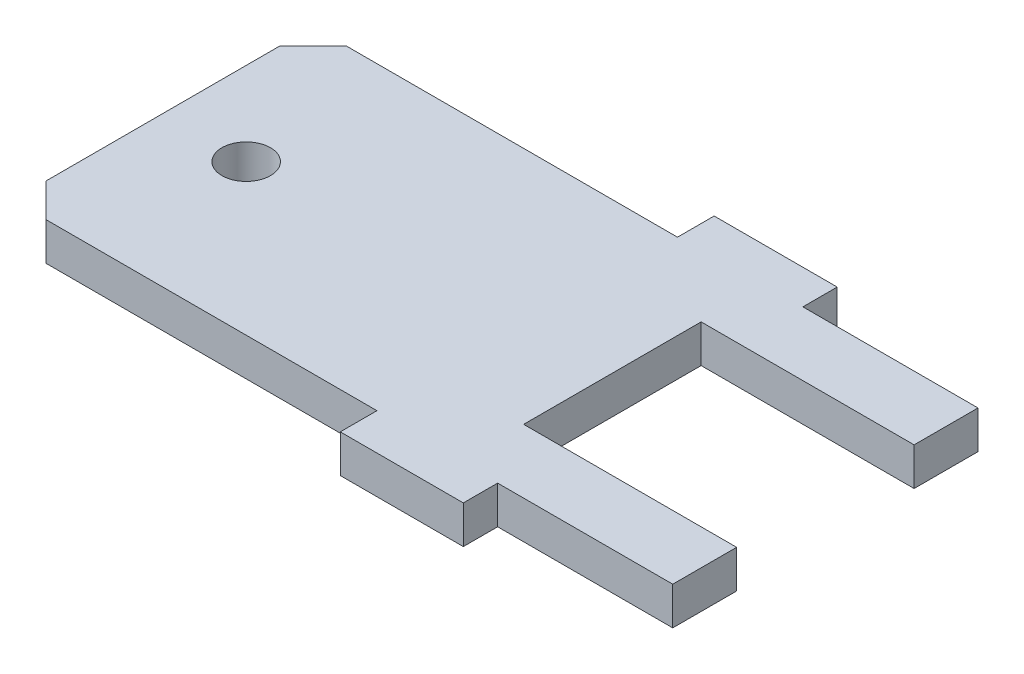
ISO-10303-21;
HEADER;
FILE_DESCRIPTION(('STEP AP214'),'2;1');
FILE_NAME('part.step','',(''),(''),'','','');
FILE_SCHEMA(('AUTOMOTIVE_DESIGN { 1 0 10303 214 1 1 1 1 }'));
ENDSEC;
DATA;
#1=APPLICATION_CONTEXT('core data for automotive mechanical design processes');
#2=APPLICATION_PROTOCOL_DEFINITION('international standard','automotive_design',2000,#1);
#3=PRODUCT_CONTEXT('',#1,'mechanical');
#4=PRODUCT('Part','Part','',(#3));
#5=PRODUCT_RELATED_PRODUCT_CATEGORY('part','',(#4));
#6=PRODUCT_DEFINITION_FORMATION('','',#4);
#7=PRODUCT_DEFINITION_CONTEXT('part definition',#1,'design');
#8=PRODUCT_DEFINITION('design','',#6,#7);
#9=PRODUCT_DEFINITION_SHAPE('','',#8);
#10=(LENGTH_UNIT() NAMED_UNIT(*) SI_UNIT(.MILLI.,.METRE.));
#11=(NAMED_UNIT(*) PLANE_ANGLE_UNIT() SI_UNIT($,.RADIAN.));
#12=(NAMED_UNIT(*) SI_UNIT($,.STERADIAN.) SOLID_ANGLE_UNIT());
#13=UNCERTAINTY_MEASURE_WITH_UNIT(LENGTH_MEASURE(1.E-05),#10,'distance_accuracy_value','');
#14=(GEOMETRIC_REPRESENTATION_CONTEXT(3) GLOBAL_UNCERTAINTY_ASSIGNED_CONTEXT((#13)) GLOBAL_UNIT_ASSIGNED_CONTEXT((#10,
#11,#12)) REPRESENTATION_CONTEXT('',''));
#15=CARTESIAN_POINT('',(0.,0.,0.));
#16=DIRECTION('',(0.,0.,1.));
#17=DIRECTION('',(1.,0.,0.));
#18=AXIS2_PLACEMENT_3D('',#15,#16,#17);
#19=CARTESIAN_POINT('',(0.,0.4,0.));
#20=DIRECTION('',(0.,-1.,0.));
#21=DIRECTION('',(0.,0.,-1.));
#22=AXIS2_PLACEMENT_3D('',#19,#20,#21);
#23=PLANE('',#22);
#24=DIRECTION('',(-0.707106781186547,0.,0.707106781186548));
#25=VECTOR('',#24,1.);
#26=CARTESIAN_POINT('',(0.,0.4,-2.46789321881345));
#27=LINE('',#26,#25);
#28=CARTESIAN_POINT('',(0.707106781186547,0.4,-3.175));
#29=VERTEX_POINT('',#28);
#30=CARTESIAN_POINT('',(0.,0.4,-2.46789321881345));
#31=VERTEX_POINT('',#30);
#32=EDGE_CURVE('E227',#29,#31,#27,.T.);
#33=ORIENTED_EDGE('',*,*,#32,.T.);
#34=DIRECTION('',(0.,0.,1.));
#35=VECTOR('',#34,1.);
#36=CARTESIAN_POINT('',(0.,0.4,2.46789321881345));
#37=LINE('',#36,#35);
#38=CARTESIAN_POINT('',(0.,0.4,2.46789321881345));
#39=VERTEX_POINT('',#38);
#40=EDGE_CURVE('E125',#31,#39,#37,.T.);
#41=ORIENTED_EDGE('',*,*,#40,.T.);
#42=DIRECTION('',(0.707106781186547,0.,0.707106781186548));
#43=VECTOR('',#42,1.);
#44=CARTESIAN_POINT('',(0.,0.4,2.46789321881345));
#45=LINE('',#44,#43);
#46=CARTESIAN_POINT('',(0.707106781186547,0.4,3.175));
#47=VERTEX_POINT('',#46);
#48=EDGE_CURVE('E272',#39,#47,#45,.T.);
#49=ORIENTED_EDGE('',*,*,#48,.T.);
#50=DIRECTION('',(1.,0.,0.));
#51=VECTOR('',#50,1.);
#52=CARTESIAN_POINT('',(0.707106781186547,0.4,3.175));
#53=LINE('',#52,#51);
#54=CARTESIAN_POINT('',(7.7,0.4,3.175));
#55=VERTEX_POINT('',#54);
#56=EDGE_CURVE('E291',#47,#55,#53,.T.);
#57=ORIENTED_EDGE('',*,*,#56,.T.);
#58=DIRECTION('',(0.,0.,1.));
#59=VECTOR('',#58,1.);
#60=CARTESIAN_POINT('',(7.7,0.4,3.175));
#61=LINE('',#60,#59);
#62=CARTESIAN_POINT('',(7.7,0.4,3.95));
#63=VERTEX_POINT('',#62);
#64=EDGE_CURVE('E288',#55,#63,#61,.T.);
#65=ORIENTED_EDGE('',*,*,#64,.T.);
#66=DIRECTION('',(1.,0.,0.));
#67=VECTOR('',#66,1.);
#68=CARTESIAN_POINT('',(7.7,0.4,3.95));
#69=LINE('',#68,#67);
#70=CARTESIAN_POINT('',(10.3,0.4,3.95));
#71=VERTEX_POINT('',#70);
#72=EDGE_CURVE('E290',#63,#71,#69,.T.);
#73=ORIENTED_EDGE('',*,*,#72,.T.);
#74=DIRECTION('',(0.,0.,-1.));
#75=VECTOR('',#74,1.);
#76=CARTESIAN_POINT('',(10.3,0.4,3.95));
#77=LINE('',#76,#75);
#78=CARTESIAN_POINT('',(10.3,0.4,3.225));
#79=VERTEX_POINT('',#78);
#80=EDGE_CURVE('E293',#71,#79,#77,.T.);
#81=ORIENTED_EDGE('',*,*,#80,.T.);
#82=DIRECTION('',(1.,0.,0.));
#83=VECTOR('',#82,1.);
#84=CARTESIAN_POINT('',(10.3,0.4,3.225));
#85=LINE('',#84,#83);
#86=CARTESIAN_POINT('',(14.,0.4,3.225));
#87=VERTEX_POINT('',#86);
#88=EDGE_CURVE('E299',#79,#87,#85,.T.);
#89=ORIENTED_EDGE('',*,*,#88,.T.);
#90=DIRECTION('',(0.,0.,-1.));
#91=VECTOR('',#90,1.);
#92=CARTESIAN_POINT('',(14.,0.4,3.225));
#93=LINE('',#92,#91);
#94=CARTESIAN_POINT('',(14.,0.4,1.875));
#95=VERTEX_POINT('',#94);
#96=EDGE_CURVE('E301',#87,#95,#93,.T.);
#97=ORIENTED_EDGE('',*,*,#96,.T.);
#98=DIRECTION('',(-1.,0.,0.));
#99=VECTOR('',#98,1.);
#100=CARTESIAN_POINT('',(14.,0.4,1.875));
#101=LINE('',#100,#99);
#102=CARTESIAN_POINT('',(9.5,0.4,1.875));
#103=VERTEX_POINT('',#102);
#104=EDGE_CURVE('E303',#95,#103,#101,.T.);
#105=ORIENTED_EDGE('',*,*,#104,.T.);
#106=DIRECTION('',(0.,0.,-1.));
#107=VECTOR('',#106,1.);
#108=CARTESIAN_POINT('',(9.5,0.4,-1.875));
#109=LINE('',#108,#107);
#110=CARTESIAN_POINT('',(9.5,0.4,-1.875));
#111=VERTEX_POINT('',#110);
#112=EDGE_CURVE('E305',#103,#111,#109,.T.);
#113=ORIENTED_EDGE('',*,*,#112,.T.);
#114=DIRECTION('',(1.,0.,0.));
#115=VECTOR('',#114,1.);
#116=CARTESIAN_POINT('',(14.,0.4,-1.875));
#117=LINE('',#116,#115);
#118=CARTESIAN_POINT('',(14.,0.4,-1.875));
#119=VERTEX_POINT('',#118);
#120=EDGE_CURVE('E307',#111,#119,#117,.T.);
#121=ORIENTED_EDGE('',*,*,#120,.T.);
#122=DIRECTION('',(0.,0.,-1.));
#123=VECTOR('',#122,1.);
#124=CARTESIAN_POINT('',(14.,0.4,-3.225));
#125=LINE('',#124,#123);
#126=CARTESIAN_POINT('',(14.,0.4,-3.225));
#127=VERTEX_POINT('',#126);
#128=EDGE_CURVE('E309',#119,#127,#125,.T.);
#129=ORIENTED_EDGE('',*,*,#128,.T.);
#130=DIRECTION('',(-1.,0.,0.));
#131=VECTOR('',#130,1.);
#132=CARTESIAN_POINT('',(10.3,0.4,-3.225));
#133=LINE('',#132,#131);
#134=CARTESIAN_POINT('',(10.3,0.4,-3.225));
#135=VERTEX_POINT('',#134);
#136=EDGE_CURVE('E311',#127,#135,#133,.T.);
#137=ORIENTED_EDGE('',*,*,#136,.T.);
#138=DIRECTION('',(0.,0.,-1.));
#139=VECTOR('',#138,1.);
#140=CARTESIAN_POINT('',(10.3,0.4,-3.95));
#141=LINE('',#140,#139);
#142=CARTESIAN_POINT('',(10.3,0.4,-3.95));
#143=VERTEX_POINT('',#142);
#144=EDGE_CURVE('E174',#135,#143,#141,.T.);
#145=ORIENTED_EDGE('',*,*,#144,.T.);
#146=DIRECTION('',(-1.,0.,0.));
#147=VECTOR('',#146,1.);
#148=CARTESIAN_POINT('',(7.7,0.4,-3.95));
#149=LINE('',#148,#147);
#150=CARTESIAN_POINT('',(7.7,0.4,-3.95));
#151=VERTEX_POINT('',#150);
#152=EDGE_CURVE('E168',#143,#151,#149,.T.);
#153=ORIENTED_EDGE('',*,*,#152,.T.);
#154=DIRECTION('',(0.,0.,1.));
#155=VECTOR('',#154,1.);
#156=CARTESIAN_POINT('',(7.7,0.4,-3.175));
#157=LINE('',#156,#155);
#158=CARTESIAN_POINT('',(7.7,0.4,-3.175));
#159=VERTEX_POINT('',#158);
#160=EDGE_CURVE('E172',#151,#159,#157,.T.);
#161=ORIENTED_EDGE('',*,*,#160,.T.);
#162=DIRECTION('',(-1.,0.,0.));
#163=VECTOR('',#162,1.);
#164=CARTESIAN_POINT('',(0.707106781186547,0.4,-3.175));
#165=LINE('',#164,#163);
#166=EDGE_CURVE('E52',#159,#29,#165,.T.);
#167=ORIENTED_EDGE('',*,*,#166,.T.);
#168=EDGE_LOOP('',(#33,#41,#49,#57,#65,#73,#81,#89,#97,#105,#113,#121,#129,#137,#145,#153,#161,#167));
#169=FACE_BOUND('',#168,.T.);
#170=CARTESIAN_POINT('',(1.76190311126471,0.4,0.));
#171=DIRECTION('',(0.,1.,0.));
#172=DIRECTION('',(0.,0.,1.));
#173=AXIS2_PLACEMENT_3D('',#170,#171,#172);
#174=CIRCLE('',#173,0.512380355604943);
#175=CARTESIAN_POINT('',(1.76190311126471,0.4,0.512380355604943));
#176=VERTEX_POINT('',#175);
#177=EDGE_CURVE('E196',#176,#176,#174,.T.);
#178=ORIENTED_EDGE('',*,*,#177,.F.);
#179=EDGE_LOOP('',(#178));
#180=FACE_BOUND('',#179,.T.);
#181=ADVANCED_FACE('F35',(#169,#180),#23,.F.);
#182=CARTESIAN_POINT('',(0.,-0.4,0.));
#183=DIRECTION('',(0.,-1.,0.));
#184=DIRECTION('',(0.,0.,-1.));
#185=AXIS2_PLACEMENT_3D('',#182,#183,#184);
#186=PLANE('',#185);
#187=DIRECTION('',(-0.707106781186547,0.,0.707106781186548));
#188=VECTOR('',#187,1.);
#189=CARTESIAN_POINT('',(0.,-0.4,-2.46789321881345));
#190=LINE('',#189,#188);
#191=CARTESIAN_POINT('',(0.707106781186547,-0.4,-3.175));
#192=VERTEX_POINT('',#191);
#193=CARTESIAN_POINT('',(0.,-0.4,-2.46789321881345));
#194=VERTEX_POINT('',#193);
#195=EDGE_CURVE('E192',#192,#194,#190,.T.);
#196=ORIENTED_EDGE('',*,*,#195,.F.);
#197=DIRECTION('',(-1.,0.,0.));
#198=VECTOR('',#197,1.);
#199=CARTESIAN_POINT('',(0.707106781186547,-0.4,-3.175));
#200=LINE('',#199,#198);
#201=CARTESIAN_POINT('',(7.7,-0.4,-3.175));
#202=VERTEX_POINT('',#201);
#203=EDGE_CURVE('E117',#202,#192,#200,.T.);
#204=ORIENTED_EDGE('',*,*,#203,.F.);
#205=DIRECTION('',(0.,0.,1.));
#206=VECTOR('',#205,1.);
#207=CARTESIAN_POINT('',(7.7,-0.4,-3.175));
#208=LINE('',#207,#206);
#209=CARTESIAN_POINT('',(7.7,-0.4,-3.95));
#210=VERTEX_POINT('',#209);
#211=EDGE_CURVE('E111',#210,#202,#208,.T.);
#212=ORIENTED_EDGE('',*,*,#211,.F.);
#213=DIRECTION('',(-1.,0.,0.));
#214=VECTOR('',#213,1.);
#215=CARTESIAN_POINT('',(7.7,-0.4,-3.95));
#216=LINE('',#215,#214);
#217=CARTESIAN_POINT('',(10.3,-0.4,-3.95));
#218=VERTEX_POINT('',#217);
#219=EDGE_CURVE('E182',#218,#210,#216,.T.);
#220=ORIENTED_EDGE('',*,*,#219,.F.);
#221=DIRECTION('',(0.,0.,-1.));
#222=VECTOR('',#221,1.);
#223=CARTESIAN_POINT('',(10.3,-0.4,-3.95));
#224=LINE('',#223,#222);
#225=CARTESIAN_POINT('',(10.3,-0.4,-3.225));
#226=VERTEX_POINT('',#225);
#227=EDGE_CURVE('E222',#226,#218,#224,.T.);
#228=ORIENTED_EDGE('',*,*,#227,.F.);
#229=DIRECTION('',(-1.,0.,0.));
#230=VECTOR('',#229,1.);
#231=CARTESIAN_POINT('',(10.3,-0.4,-3.225));
#232=LINE('',#231,#230);
#233=CARTESIAN_POINT('',(14.,-0.4,-3.225));
#234=VERTEX_POINT('',#233);
#235=EDGE_CURVE('E220',#234,#226,#232,.T.);
#236=ORIENTED_EDGE('',*,*,#235,.F.);
#237=DIRECTION('',(0.,0.,-1.));
#238=VECTOR('',#237,1.);
#239=CARTESIAN_POINT('',(14.,-0.4,-3.225));
#240=LINE('',#239,#238);
#241=CARTESIAN_POINT('',(14.,-0.4,-1.875));
#242=VERTEX_POINT('',#241);
#243=EDGE_CURVE('E218',#242,#234,#240,.T.);
#244=ORIENTED_EDGE('',*,*,#243,.F.);
#245=DIRECTION('',(1.,0.,0.));
#246=VECTOR('',#245,1.);
#247=CARTESIAN_POINT('',(14.,-0.4,-1.875));
#248=LINE('',#247,#246);
#249=CARTESIAN_POINT('',(9.5,-0.4,-1.875));
#250=VERTEX_POINT('',#249);
#251=EDGE_CURVE('E216',#250,#242,#248,.T.);
#252=ORIENTED_EDGE('',*,*,#251,.F.);
#253=DIRECTION('',(0.,0.,-1.));
#254=VECTOR('',#253,1.);
#255=CARTESIAN_POINT('',(9.5,-0.4,-1.875));
#256=LINE('',#255,#254);
#257=CARTESIAN_POINT('',(9.5,-0.4,1.875));
#258=VERTEX_POINT('',#257);
#259=EDGE_CURVE('E214',#258,#250,#256,.T.);
#260=ORIENTED_EDGE('',*,*,#259,.F.);
#261=DIRECTION('',(-1.,0.,0.));
#262=VECTOR('',#261,1.);
#263=CARTESIAN_POINT('',(14.,-0.4,1.875));
#264=LINE('',#263,#262);
#265=CARTESIAN_POINT('',(14.,-0.4,1.875));
#266=VERTEX_POINT('',#265);
#267=EDGE_CURVE('E212',#266,#258,#264,.T.);
#268=ORIENTED_EDGE('',*,*,#267,.F.);
#269=DIRECTION('',(0.,0.,-1.));
#270=VECTOR('',#269,1.);
#271=CARTESIAN_POINT('',(14.,-0.4,3.225));
#272=LINE('',#271,#270);
#273=CARTESIAN_POINT('',(14.,-0.4,3.225));
#274=VERTEX_POINT('',#273);
#275=EDGE_CURVE('E210',#274,#266,#272,.T.);
#276=ORIENTED_EDGE('',*,*,#275,.F.);
#277=DIRECTION('',(1.,0.,0.));
#278=VECTOR('',#277,1.);
#279=CARTESIAN_POINT('',(10.3,-0.4,3.225));
#280=LINE('',#279,#278);
#281=CARTESIAN_POINT('',(10.3,-0.4,3.225));
#282=VERTEX_POINT('',#281);
#283=EDGE_CURVE('E208',#282,#274,#280,.T.);
#284=ORIENTED_EDGE('',*,*,#283,.F.);
#285=DIRECTION('',(0.,0.,-1.));
#286=VECTOR('',#285,1.);
#287=CARTESIAN_POINT('',(10.3,-0.4,3.95));
#288=LINE('',#287,#286);
#289=CARTESIAN_POINT('',(10.3,-0.4,3.95));
#290=VERTEX_POINT('',#289);
#291=EDGE_CURVE('E206',#290,#282,#288,.T.);
#292=ORIENTED_EDGE('',*,*,#291,.F.);
#293=DIRECTION('',(1.,0.,0.));
#294=VECTOR('',#293,1.);
#295=CARTESIAN_POINT('',(7.7,-0.4,3.95));
#296=LINE('',#295,#294);
#297=CARTESIAN_POINT('',(7.7,-0.4,3.95));
#298=VERTEX_POINT('',#297);
#299=EDGE_CURVE('E204',#298,#290,#296,.T.);
#300=ORIENTED_EDGE('',*,*,#299,.F.);
#301=DIRECTION('',(0.,0.,1.));
#302=VECTOR('',#301,1.);
#303=CARTESIAN_POINT('',(7.7,-0.4,3.175));
#304=LINE('',#303,#302);
#305=CARTESIAN_POINT('',(7.7,-0.4,3.175));
#306=VERTEX_POINT('',#305);
#307=EDGE_CURVE('E202',#306,#298,#304,.T.);
#308=ORIENTED_EDGE('',*,*,#307,.F.);
#309=DIRECTION('',(1.,0.,0.));
#310=VECTOR('',#309,1.);
#311=CARTESIAN_POINT('',(0.707106781186547,-0.4,3.175));
#312=LINE('',#311,#310);
#313=CARTESIAN_POINT('',(0.707106781186547,-0.4,3.175));
#314=VERTEX_POINT('',#313);
#315=EDGE_CURVE('E200',#314,#306,#312,.T.);
#316=ORIENTED_EDGE('',*,*,#315,.F.);
#317=DIRECTION('',(0.707106781186547,0.,0.707106781186548));
#318=VECTOR('',#317,1.);
#319=CARTESIAN_POINT('',(0.,-0.4,2.46789321881345));
#320=LINE('',#319,#318);
#321=CARTESIAN_POINT('',(0.,-0.4,2.46789321881345));
#322=VERTEX_POINT('',#321);
#323=EDGE_CURVE('E198',#322,#314,#320,.T.);
#324=ORIENTED_EDGE('',*,*,#323,.F.);
#325=DIRECTION('',(0.,0.,1.));
#326=VECTOR('',#325,1.);
#327=CARTESIAN_POINT('',(0.,-0.4,2.46789321881345));
#328=LINE('',#327,#326);
#329=EDGE_CURVE('E195',#194,#322,#328,.T.);
#330=ORIENTED_EDGE('',*,*,#329,.F.);
#331=EDGE_LOOP('',(#196,#204,#212,#220,#228,#236,#244,#252,#260,#268,#276,#284,#292,#300,#308,
#316,#324,#330));
#332=FACE_BOUND('',#331,.T.);
#333=CARTESIAN_POINT('',(1.76190311126471,-0.4,0.));
#334=DIRECTION('',(0.,1.,0.));
#335=DIRECTION('',(0.,0.,1.));
#336=AXIS2_PLACEMENT_3D('',#333,#334,#335);
#337=CIRCLE('',#336,0.512380355604943);
#338=CARTESIAN_POINT('',(1.76190311126471,-0.4,0.512380355604943));
#339=VERTEX_POINT('',#338);
#340=EDGE_CURVE('E536',#339,#339,#337,.T.);
#341=ORIENTED_EDGE('',*,*,#340,.T.);
#342=EDGE_LOOP('',(#341));
#343=FACE_BOUND('',#342,.T.);
#344=ADVANCED_FACE('F276',(#332,#343),#186,.T.);
#345=CARTESIAN_POINT('',(0.,0.4,-2.46789321881345));
#346=DIRECTION('',(0.707106781186548,0.,0.707106781186547));
#347=DIRECTION('',(0.707106781186547,0.,-0.707106781186548));
#348=AXIS2_PLACEMENT_3D('',#345,#346,#347);
#349=PLANE('',#348);
#350=ORIENTED_EDGE('',*,*,#195,.T.);
#351=DIRECTION('',(0.,-1.,0.));
#352=VECTOR('',#351,1.);
#353=CARTESIAN_POINT('',(0.,0.4,-2.46789321881345));
#354=LINE('',#353,#352);
#355=EDGE_CURVE('E11',#31,#194,#354,.T.);
#356=ORIENTED_EDGE('',*,*,#355,.F.);
#357=ORIENTED_EDGE('',*,*,#32,.F.);
#358=DIRECTION('',(0.,-1.,0.));
#359=VECTOR('',#358,1.);
#360=CARTESIAN_POINT('',(0.707106781186547,0.4,-3.175));
#361=LINE('',#360,#359);
#362=EDGE_CURVE('E188',#29,#192,#361,.T.);
#363=ORIENTED_EDGE('',*,*,#362,.T.);
#364=EDGE_LOOP('',(#350,#356,#357,#363));
#365=FACE_BOUND('',#364,.T.);
#366=ADVANCED_FACE('F37',(#365),#349,.F.);
#367=CARTESIAN_POINT('',(0.,0.4,2.46789321881345));
#368=DIRECTION('',(1.,0.,0.));
#369=DIRECTION('',(0.,0.,-1.));
#370=AXIS2_PLACEMENT_3D('',#367,#368,#369);
#371=PLANE('',#370);
#372=ORIENTED_EDGE('',*,*,#329,.T.);
#373=DIRECTION('',(0.,-1.,0.));
#374=VECTOR('',#373,1.);
#375=CARTESIAN_POINT('',(0.,0.4,2.46789321881345));
#376=LINE('',#375,#374);
#377=EDGE_CURVE('E44',#39,#322,#376,.T.);
#378=ORIENTED_EDGE('',*,*,#377,.F.);
#379=ORIENTED_EDGE('',*,*,#40,.F.);
#380=ORIENTED_EDGE('',*,*,#355,.T.);
#381=EDGE_LOOP('',(#372,#378,#379,#380));
#382=FACE_BOUND('',#381,.T.);
#383=ADVANCED_FACE('F345',(#382),#371,.F.);
#384=CARTESIAN_POINT('',(0.,0.4,2.46789321881345));
#385=DIRECTION('',(0.707106781186548,0.,-0.707106781186547));
#386=DIRECTION('',(-0.707106781186547,0.,-0.707106781186548));
#387=AXIS2_PLACEMENT_3D('',#384,#385,#386);
#388=PLANE('',#387);
#389=ORIENTED_EDGE('',*,*,#323,.T.);
#390=DIRECTION('',(0.,-1.,0.));
#391=VECTOR('',#390,1.);
#392=CARTESIAN_POINT('',(0.707106781186547,0.4,3.175));
#393=LINE('',#392,#391);
#394=EDGE_CURVE('E264',#47,#314,#393,.T.);
#395=ORIENTED_EDGE('',*,*,#394,.F.);
#396=ORIENTED_EDGE('',*,*,#48,.F.);
#397=ORIENTED_EDGE('',*,*,#377,.T.);
#398=EDGE_LOOP('',(#389,#395,#396,#397));
#399=FACE_BOUND('',#398,.T.);
#400=ADVANCED_FACE('F270',(#399),#388,.F.);
#401=CARTESIAN_POINT('',(0.707106781186547,0.4,3.175));
#402=DIRECTION('',(0.,0.,-1.));
#403=DIRECTION('',(-1.,0.,0.));
#404=AXIS2_PLACEMENT_3D('',#401,#402,#403);
#405=PLANE('',#404);
#406=ORIENTED_EDGE('',*,*,#315,.T.);
#407=DIRECTION('',(0.,-1.,0.));
#408=VECTOR('',#407,1.);
#409=CARTESIAN_POINT('',(7.7,0.4,3.175));
#410=LINE('',#409,#408);
#411=EDGE_CURVE('E261',#55,#306,#410,.T.);
#412=ORIENTED_EDGE('',*,*,#411,.F.);
#413=ORIENTED_EDGE('',*,*,#56,.F.);
#414=ORIENTED_EDGE('',*,*,#394,.T.);
#415=EDGE_LOOP('',(#406,#412,#413,#414));
#416=FACE_BOUND('',#415,.T.);
#417=ADVANCED_FACE('F282',(#416),#405,.F.);
#418=CARTESIAN_POINT('',(7.7,0.4,3.175));
#419=DIRECTION('',(1.,0.,0.));
#420=DIRECTION('',(0.,0.,-1.));
#421=AXIS2_PLACEMENT_3D('',#418,#419,#420);
#422=PLANE('',#421);
#423=ORIENTED_EDGE('',*,*,#307,.T.);
#424=DIRECTION('',(0.,-1.,0.));
#425=VECTOR('',#424,1.);
#426=CARTESIAN_POINT('',(7.7,0.4,3.95));
#427=LINE('',#426,#425);
#428=EDGE_CURVE('E258',#63,#298,#427,.T.);
#429=ORIENTED_EDGE('',*,*,#428,.F.);
#430=ORIENTED_EDGE('',*,*,#64,.F.);
#431=ORIENTED_EDGE('',*,*,#411,.T.);
#432=EDGE_LOOP('',(#423,#429,#430,#431));
#433=FACE_BOUND('',#432,.T.);
#434=ADVANCED_FACE('F286',(#433),#422,.F.);
#435=CARTESIAN_POINT('',(7.7,0.4,3.95));
#436=DIRECTION('',(0.,0.,-1.));
#437=DIRECTION('',(-1.,0.,0.));
#438=AXIS2_PLACEMENT_3D('',#435,#436,#437);
#439=PLANE('',#438);
#440=ORIENTED_EDGE('',*,*,#299,.T.);
#441=DIRECTION('',(0.,-1.,0.));
#442=VECTOR('',#441,1.);
#443=CARTESIAN_POINT('',(10.3,0.4,3.95));
#444=LINE('',#443,#442);
#445=EDGE_CURVE('E255',#71,#290,#444,.T.);
#446=ORIENTED_EDGE('',*,*,#445,.F.);
#447=ORIENTED_EDGE('',*,*,#72,.F.);
#448=ORIENTED_EDGE('',*,*,#428,.T.);
#449=EDGE_LOOP('',(#440,#446,#447,#448));
#450=FACE_BOUND('',#449,.T.);
#451=ADVANCED_FACE('F358',(#450),#439,.F.);
#452=CARTESIAN_POINT('',(10.3,0.4,3.95));
#453=DIRECTION('',(-1.,0.,0.));
#454=DIRECTION('',(0.,0.,1.));
#455=AXIS2_PLACEMENT_3D('',#452,#453,#454);
#456=PLANE('',#455);
#457=ORIENTED_EDGE('',*,*,#291,.T.);
#458=DIRECTION('',(0.,-1.,0.));
#459=VECTOR('',#458,1.);
#460=CARTESIAN_POINT('',(10.3,0.4,3.225));
#461=LINE('',#460,#459);
#462=EDGE_CURVE('E252',#79,#282,#461,.T.);
#463=ORIENTED_EDGE('',*,*,#462,.F.);
#464=ORIENTED_EDGE('',*,*,#80,.F.);
#465=ORIENTED_EDGE('',*,*,#445,.T.);
#466=EDGE_LOOP('',(#457,#463,#464,#465));
#467=FACE_BOUND('',#466,.T.);
#468=ADVANCED_FACE('F361',(#467),#456,.F.);
#469=CARTESIAN_POINT('',(10.3,0.4,3.225));
#470=DIRECTION('',(0.,0.,-1.));
#471=DIRECTION('',(-1.,0.,0.));
#472=AXIS2_PLACEMENT_3D('',#469,#470,#471);
#473=PLANE('',#472);
#474=ORIENTED_EDGE('',*,*,#283,.T.);
#475=DIRECTION('',(0.,-1.,0.));
#476=VECTOR('',#475,1.);
#477=CARTESIAN_POINT('',(14.,0.4,3.225));
#478=LINE('',#477,#476);
#479=EDGE_CURVE('E249',#87,#274,#478,.T.);
#480=ORIENTED_EDGE('',*,*,#479,.F.);
#481=ORIENTED_EDGE('',*,*,#88,.F.);
#482=ORIENTED_EDGE('',*,*,#462,.T.);
#483=EDGE_LOOP('',(#474,#480,#481,#482));
#484=FACE_BOUND('',#483,.T.);
#485=ADVANCED_FACE('F365',(#484),#473,.F.);
#486=CARTESIAN_POINT('',(14.,0.4,3.225));
#487=DIRECTION('',(-1.,0.,0.));
#488=DIRECTION('',(0.,0.,1.));
#489=AXIS2_PLACEMENT_3D('',#486,#487,#488);
#490=PLANE('',#489);
#491=ORIENTED_EDGE('',*,*,#275,.T.);
#492=DIRECTION('',(0.,-1.,0.));
#493=VECTOR('',#492,1.);
#494=CARTESIAN_POINT('',(14.,0.4,1.875));
#495=LINE('',#494,#493);
#496=EDGE_CURVE('E246',#95,#266,#495,.T.);
#497=ORIENTED_EDGE('',*,*,#496,.F.);
#498=ORIENTED_EDGE('',*,*,#96,.F.);
#499=ORIENTED_EDGE('',*,*,#479,.T.);
#500=EDGE_LOOP('',(#491,#497,#498,#499));
#501=FACE_BOUND('',#500,.T.);
#502=ADVANCED_FACE('F369',(#501),#490,.F.);
#503=CARTESIAN_POINT('',(14.,0.4,1.875));
#504=DIRECTION('',(0.,0.,1.));
#505=DIRECTION('',(1.,0.,0.));
#506=AXIS2_PLACEMENT_3D('',#503,#504,#505);
#507=PLANE('',#506);
#508=ORIENTED_EDGE('',*,*,#267,.T.);
#509=DIRECTION('',(0.,-1.,0.));
#510=VECTOR('',#509,1.);
#511=CARTESIAN_POINT('',(9.5,0.4,1.875));
#512=LINE('',#511,#510);
#513=EDGE_CURVE('E243',#103,#258,#512,.T.);
#514=ORIENTED_EDGE('',*,*,#513,.F.);
#515=ORIENTED_EDGE('',*,*,#104,.F.);
#516=ORIENTED_EDGE('',*,*,#496,.T.);
#517=EDGE_LOOP('',(#508,#514,#515,#516));
#518=FACE_BOUND('',#517,.T.);
#519=ADVANCED_FACE('F373',(#518),#507,.F.);
#520=CARTESIAN_POINT('',(9.5,0.4,-1.875));
#521=DIRECTION('',(-1.,0.,0.));
#522=DIRECTION('',(0.,0.,1.));
#523=AXIS2_PLACEMENT_3D('',#520,#521,#522);
#524=PLANE('',#523);
#525=ORIENTED_EDGE('',*,*,#259,.T.);
#526=DIRECTION('',(0.,-1.,0.));
#527=VECTOR('',#526,1.);
#528=CARTESIAN_POINT('',(9.5,0.4,-1.875));
#529=LINE('',#528,#527);
#530=EDGE_CURVE('E240',#111,#250,#529,.T.);
#531=ORIENTED_EDGE('',*,*,#530,.F.);
#532=ORIENTED_EDGE('',*,*,#112,.F.);
#533=ORIENTED_EDGE('',*,*,#513,.T.);
#534=EDGE_LOOP('',(#525,#531,#532,#533));
#535=FACE_BOUND('',#534,.T.);
#536=ADVANCED_FACE('F377',(#535),#524,.F.);
#537=CARTESIAN_POINT('',(14.,0.4,-1.875));
#538=DIRECTION('',(0.,0.,-1.));
#539=DIRECTION('',(-1.,0.,0.));
#540=AXIS2_PLACEMENT_3D('',#537,#538,#539);
#541=PLANE('',#540);
#542=ORIENTED_EDGE('',*,*,#251,.T.);
#543=DIRECTION('',(0.,-1.,0.));
#544=VECTOR('',#543,1.);
#545=CARTESIAN_POINT('',(14.,0.4,-1.875));
#546=LINE('',#545,#544);
#547=EDGE_CURVE('E237',#119,#242,#546,.T.);
#548=ORIENTED_EDGE('',*,*,#547,.F.);
#549=ORIENTED_EDGE('',*,*,#120,.F.);
#550=ORIENTED_EDGE('',*,*,#530,.T.);
#551=EDGE_LOOP('',(#542,#548,#549,#550));
#552=FACE_BOUND('',#551,.T.);
#553=ADVANCED_FACE('F381',(#552),#541,.F.);
#554=CARTESIAN_POINT('',(14.,0.4,-3.225));
#555=DIRECTION('',(-1.,0.,0.));
#556=DIRECTION('',(0.,0.,1.));
#557=AXIS2_PLACEMENT_3D('',#554,#555,#556);
#558=PLANE('',#557);
#559=ORIENTED_EDGE('',*,*,#243,.T.);
#560=DIRECTION('',(0.,-1.,0.));
#561=VECTOR('',#560,1.);
#562=CARTESIAN_POINT('',(14.,0.4,-3.225));
#563=LINE('',#562,#561);
#564=EDGE_CURVE('E234',#127,#234,#563,.T.);
#565=ORIENTED_EDGE('',*,*,#564,.F.);
#566=ORIENTED_EDGE('',*,*,#128,.F.);
#567=ORIENTED_EDGE('',*,*,#547,.T.);
#568=EDGE_LOOP('',(#559,#565,#566,#567));
#569=FACE_BOUND('',#568,.T.);
#570=ADVANCED_FACE('F385',(#569),#558,.F.);
#571=CARTESIAN_POINT('',(10.3,0.4,-3.225));
#572=DIRECTION('',(0.,0.,1.));
#573=DIRECTION('',(1.,0.,0.));
#574=AXIS2_PLACEMENT_3D('',#571,#572,#573);
#575=PLANE('',#574);
#576=ORIENTED_EDGE('',*,*,#235,.T.);
#577=DIRECTION('',(0.,-1.,0.));
#578=VECTOR('',#577,1.);
#579=CARTESIAN_POINT('',(10.3,0.4,-3.225));
#580=LINE('',#579,#578);
#581=EDGE_CURVE('E231',#135,#226,#580,.T.);
#582=ORIENTED_EDGE('',*,*,#581,.F.);
#583=ORIENTED_EDGE('',*,*,#136,.F.);
#584=ORIENTED_EDGE('',*,*,#564,.T.);
#585=EDGE_LOOP('',(#576,#582,#583,#584));
#586=FACE_BOUND('',#585,.T.);
#587=ADVANCED_FACE('F317',(#586),#575,.F.);
#588=CARTESIAN_POINT('',(10.3,0.4,-3.95));
#589=DIRECTION('',(-1.,0.,0.));
#590=DIRECTION('',(0.,0.,1.));
#591=AXIS2_PLACEMENT_3D('',#588,#589,#590);
#592=PLANE('',#591);
#593=ORIENTED_EDGE('',*,*,#227,.T.);
#594=DIRECTION('',(0.,-1.,0.));
#595=VECTOR('',#594,1.);
#596=CARTESIAN_POINT('',(10.3,0.4,-3.95));
#597=LINE('',#596,#595);
#598=EDGE_CURVE('E183',#143,#218,#597,.T.);
#599=ORIENTED_EDGE('',*,*,#598,.F.);
#600=ORIENTED_EDGE('',*,*,#144,.F.);
#601=ORIENTED_EDGE('',*,*,#581,.T.);
#602=EDGE_LOOP('',(#593,#599,#600,#601));
#603=FACE_BOUND('',#602,.T.);
#604=ADVANCED_FACE('F321',(#603),#592,.F.);
#605=CARTESIAN_POINT('',(7.7,0.4,-3.95));
#606=DIRECTION('',(0.,0.,1.));
#607=DIRECTION('',(1.,0.,0.));
#608=AXIS2_PLACEMENT_3D('',#605,#606,#607);
#609=PLANE('',#608);
#610=ORIENTED_EDGE('',*,*,#219,.T.);
#611=DIRECTION('',(0.,-1.,0.));
#612=VECTOR('',#611,1.);
#613=CARTESIAN_POINT('',(7.7,0.4,-3.95));
#614=LINE('',#613,#612);
#615=EDGE_CURVE('E179',#151,#210,#614,.T.);
#616=ORIENTED_EDGE('',*,*,#615,.F.);
#617=ORIENTED_EDGE('',*,*,#152,.F.);
#618=ORIENTED_EDGE('',*,*,#598,.T.);
#619=EDGE_LOOP('',(#610,#616,#617,#618));
#620=FACE_BOUND('',#619,.T.);
#621=ADVANCED_FACE('F180',(#620),#609,.F.);
#622=CARTESIAN_POINT('',(7.7,0.4,-3.175));
#623=DIRECTION('',(1.,0.,0.));
#624=DIRECTION('',(0.,0.,-1.));
#625=AXIS2_PLACEMENT_3D('',#622,#623,#624);
#626=PLANE('',#625);
#627=ORIENTED_EDGE('',*,*,#211,.T.);
#628=DIRECTION('',(0.,-1.,0.));
#629=VECTOR('',#628,1.);
#630=CARTESIAN_POINT('',(7.7,0.4,-3.175));
#631=LINE('',#630,#629);
#632=EDGE_CURVE('E184',#159,#202,#631,.T.);
#633=ORIENTED_EDGE('',*,*,#632,.F.);
#634=ORIENTED_EDGE('',*,*,#160,.F.);
#635=ORIENTED_EDGE('',*,*,#615,.T.);
#636=EDGE_LOOP('',(#627,#633,#634,#635));
#637=FACE_BOUND('',#636,.T.);
#638=ADVANCED_FACE('F186',(#637),#626,.F.);
#639=CARTESIAN_POINT('',(0.707106781186547,0.4,-3.175));
#640=DIRECTION('',(0.,0.,1.));
#641=DIRECTION('',(1.,0.,0.));
#642=AXIS2_PLACEMENT_3D('',#639,#640,#641);
#643=PLANE('',#642);
#644=ORIENTED_EDGE('',*,*,#203,.T.);
#645=ORIENTED_EDGE('',*,*,#362,.F.);
#646=ORIENTED_EDGE('',*,*,#166,.F.);
#647=ORIENTED_EDGE('',*,*,#632,.T.);
#648=EDGE_LOOP('',(#644,#645,#646,#647));
#649=FACE_BOUND('',#648,.T.);
#650=ADVANCED_FACE('F325',(#649),#643,.F.);
#651=CARTESIAN_POINT('',(1.76190311126471,0.4,0.));
#652=DIRECTION('',(0.,-1.,0.));
#653=DIRECTION('',(0.,0.,-1.));
#654=AXIS2_PLACEMENT_3D('',#651,#652,#653);
#655=CYLINDRICAL_SURFACE('',#654,0.512380355604943);
#656=ORIENTED_EDGE('',*,*,#177,.T.);
#657=EDGE_LOOP('',(#656));
#658=FACE_BOUND('',#657,.T.);
#659=ORIENTED_EDGE('',*,*,#340,.F.);
#660=EDGE_LOOP('',(#659));
#661=FACE_BOUND('',#660,.T.);
#662=ADVANCED_FACE('F327',(#658,#661),#655,.F.);
#663=CLOSED_SHELL('',(#181,#344,#366,#383,#400,#417,#434,#451,#468,#485,#502,#519,#536,#553,
#570,#587,#604,#621,#638,#650,#662));
#664=MANIFOLD_SOLID_BREP('B2',#663);
#665=ADVANCED_BREP_SHAPE_REPRESENTATION('',(#18,#664),#14);
#666=SHAPE_DEFINITION_REPRESENTATION(#9,#665);
ENDSEC;
END-ISO-10303-21;
